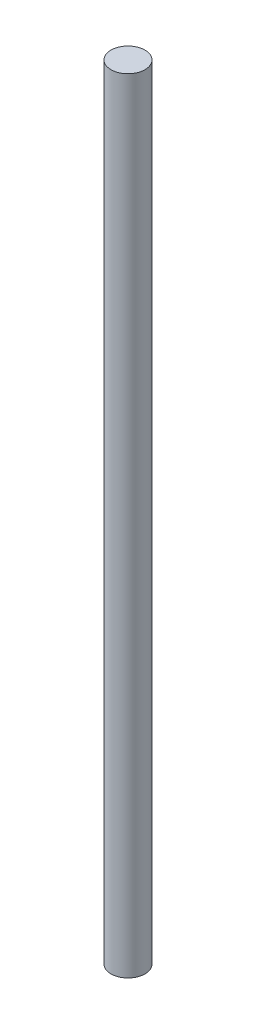
ISO-10303-21;
HEADER;
FILE_DESCRIPTION(('STEP AP214'),'2;1');
FILE_NAME('part.step','',(''),(''),'','','');
FILE_SCHEMA(('AUTOMOTIVE_DESIGN { 1 0 10303 214 1 1 1 1 }'));
ENDSEC;
DATA;
#1=APPLICATION_CONTEXT('core data for automotive mechanical design processes');
#2=APPLICATION_PROTOCOL_DEFINITION('international standard','automotive_design',2000,#1);
#3=PRODUCT_CONTEXT('',#1,'mechanical');
#4=PRODUCT('Part','Part','',(#3));
#5=PRODUCT_RELATED_PRODUCT_CATEGORY('part','',(#4));
#6=PRODUCT_DEFINITION_FORMATION('','',#4);
#7=PRODUCT_DEFINITION_CONTEXT('part definition',#1,'design');
#8=PRODUCT_DEFINITION('design','',#6,#7);
#9=PRODUCT_DEFINITION_SHAPE('','',#8);
#10=(LENGTH_UNIT() NAMED_UNIT(*) SI_UNIT(.MILLI.,.METRE.));
#11=(NAMED_UNIT(*) PLANE_ANGLE_UNIT() SI_UNIT($,.RADIAN.));
#12=(NAMED_UNIT(*) SI_UNIT($,.STERADIAN.) SOLID_ANGLE_UNIT());
#13=UNCERTAINTY_MEASURE_WITH_UNIT(LENGTH_MEASURE(1.E-05),#10,'distance_accuracy_value','');
#14=(GEOMETRIC_REPRESENTATION_CONTEXT(3) GLOBAL_UNCERTAINTY_ASSIGNED_CONTEXT((#13)) GLOBAL_UNIT_ASSIGNED_CONTEXT((#10,
#11,#12)) REPRESENTATION_CONTEXT('',''));
#15=CARTESIAN_POINT('',(0.,0.,0.));
#16=DIRECTION('',(0.,0.,1.));
#17=DIRECTION('',(1.,0.,0.));
#18=AXIS2_PLACEMENT_3D('',#15,#16,#17);
#19=CARTESIAN_POINT('',(0.,63.5,0.));
#20=DIRECTION('',(0.,-1.,0.));
#21=DIRECTION('',(0.,0.,-1.));
#22=AXIS2_PLACEMENT_3D('',#19,#20,#21);
#23=CYLINDRICAL_SURFACE('',#22,1.37795);
#24=CARTESIAN_POINT('',(0.,63.5,0.));
#25=DIRECTION('',(0.,1.,0.));
#26=DIRECTION('',(0.,0.,1.));
#27=AXIS2_PLACEMENT_3D('',#24,#25,#26);
#28=CIRCLE('',#27,1.37795);
#29=CARTESIAN_POINT('',(0.,63.5,1.37795));
#30=VERTEX_POINT('',#29);
#31=EDGE_CURVE('E10',#30,#30,#28,.T.);
#32=ORIENTED_EDGE('',*,*,#31,.F.);
#33=EDGE_LOOP('',(#32));
#34=FACE_BOUND('',#33,.T.);
#35=CARTESIAN_POINT('',(0.,0.,0.));
#36=DIRECTION('',(0.,1.,0.));
#37=DIRECTION('',(0.,0.,1.));
#38=AXIS2_PLACEMENT_3D('',#35,#36,#37);
#39=CIRCLE('',#38,1.37795);
#40=CARTESIAN_POINT('',(0.,0.,1.37795));
#41=VERTEX_POINT('',#40);
#42=EDGE_CURVE('E36',#41,#41,#39,.T.);
#43=ORIENTED_EDGE('',*,*,#42,.T.);
#44=EDGE_LOOP('',(#43));
#45=FACE_BOUND('',#44,.T.);
#46=ADVANCED_FACE('F33',(#34,#45),#23,.T.);
#47=CARTESIAN_POINT('',(0.,63.5,0.));
#48=DIRECTION('',(0.,1.,0.));
#49=DIRECTION('',(0.,0.,1.));
#50=AXIS2_PLACEMENT_3D('',#47,#48,#49);
#51=PLANE('',#50);
#52=ORIENTED_EDGE('',*,*,#31,.T.);
#53=EDGE_LOOP('',(#52));
#54=FACE_BOUND('',#53,.T.);
#55=ADVANCED_FACE('F48',(#54),#51,.T.);
#56=CARTESIAN_POINT('',(0.,0.,0.));
#57=DIRECTION('',(0.,1.,0.));
#58=DIRECTION('',(0.,0.,1.));
#59=AXIS2_PLACEMENT_3D('',#56,#57,#58);
#60=PLANE('',#59);
#61=ORIENTED_EDGE('',*,*,#42,.F.);
#62=EDGE_LOOP('',(#61));
#63=FACE_BOUND('',#62,.T.);
#64=ADVANCED_FACE('F46',(#63),#60,.F.);
#65=CLOSED_SHELL('',(#46,#55,#64));
#66=MANIFOLD_SOLID_BREP('B2',#65);
#67=ADVANCED_BREP_SHAPE_REPRESENTATION('',(#18,#66),#14);
#68=SHAPE_DEFINITION_REPRESENTATION(#9,#67);
ENDSEC;
END-ISO-10303-21;
